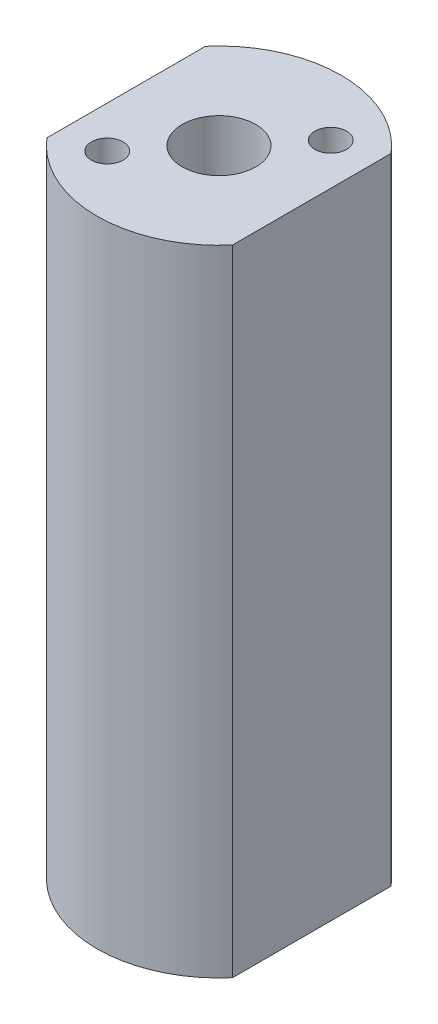
ISO-10303-21;
HEADER;
FILE_DESCRIPTION(('STEP AP214'),'2;1');
FILE_NAME('part.step','',(''),(''),'','','');
FILE_SCHEMA(('AUTOMOTIVE_DESIGN { 1 0 10303 214 1 1 1 1 }'));
ENDSEC;
DATA;
#1=APPLICATION_CONTEXT('core data for automotive mechanical design processes');
#2=APPLICATION_PROTOCOL_DEFINITION('international standard','automotive_design',2000,#1);
#3=PRODUCT_CONTEXT('',#1,'mechanical');
#4=PRODUCT('Part','Part','',(#3));
#5=PRODUCT_RELATED_PRODUCT_CATEGORY('part','',(#4));
#6=PRODUCT_DEFINITION_FORMATION('','',#4);
#7=PRODUCT_DEFINITION_CONTEXT('part definition',#1,'design');
#8=PRODUCT_DEFINITION('design','',#6,#7);
#9=PRODUCT_DEFINITION_SHAPE('','',#8);
#10=(LENGTH_UNIT() NAMED_UNIT(*) SI_UNIT(.MILLI.,.METRE.));
#11=(NAMED_UNIT(*) PLANE_ANGLE_UNIT() SI_UNIT($,.RADIAN.));
#12=(NAMED_UNIT(*) SI_UNIT($,.STERADIAN.) SOLID_ANGLE_UNIT());
#13=UNCERTAINTY_MEASURE_WITH_UNIT(LENGTH_MEASURE(1.E-05),#10,'distance_accuracy_value','');
#14=(GEOMETRIC_REPRESENTATION_CONTEXT(3) GLOBAL_UNCERTAINTY_ASSIGNED_CONTEXT((#13)) GLOBAL_UNIT_ASSIGNED_CONTEXT((#10,
#11,#12)) REPRESENTATION_CONTEXT('',''));
#15=CARTESIAN_POINT('',(0.,0.,0.));
#16=DIRECTION('',(0.,0.,1.));
#17=DIRECTION('',(1.,0.,0.));
#18=AXIS2_PLACEMENT_3D('',#15,#16,#17);
#19=CARTESIAN_POINT('',(0.,40.,0.));
#20=DIRECTION('',(0.,-1.,0.));
#21=DIRECTION('',(0.,0.,-1.));
#22=AXIS2_PLACEMENT_3D('',#19,#20,#21);
#23=CYLINDRICAL_SURFACE('',#22,7.695);
#24=CARTESIAN_POINT('',(0.,0.,0.));
#25=DIRECTION('',(0.,1.,0.));
#26=DIRECTION('',(0.,0.,1.));
#27=AXIS2_PLACEMENT_3D('',#24,#25,#26);
#28=CIRCLE('',#27,7.695);
#29=CARTESIAN_POINT('',(5.85,0.,-4.99905241020736));
#30=VERTEX_POINT('',#29);
#31=CARTESIAN_POINT('',(-5.85,0.,-4.99905241020736));
#32=VERTEX_POINT('',#31);
#33=EDGE_CURVE('E97',#30,#32,#28,.T.);
#34=ORIENTED_EDGE('',*,*,#33,.T.);
#35=DIRECTION('',(0.,-1.,0.));
#36=VECTOR('',#35,1.);
#37=CARTESIAN_POINT('',(-5.85,40.,-4.99905241020736));
#38=LINE('',#37,#36);
#39=CARTESIAN_POINT('',(-5.85,40.,-4.99905241020736));
#40=VERTEX_POINT('',#39);
#41=EDGE_CURVE('E11',#40,#32,#38,.T.);
#42=ORIENTED_EDGE('',*,*,#41,.F.);
#43=CARTESIAN_POINT('',(0.,40.,0.));
#44=DIRECTION('',(0.,1.,0.));
#45=DIRECTION('',(0.,0.,1.));
#46=AXIS2_PLACEMENT_3D('',#43,#44,#45);
#47=CIRCLE('',#46,7.695);
#48=CARTESIAN_POINT('',(5.85,40.,-4.99905241020736));
#49=VERTEX_POINT('',#48);
#50=EDGE_CURVE('E85',#49,#40,#47,.T.);
#51=ORIENTED_EDGE('',*,*,#50,.F.);
#52=DIRECTION('',(0.,-1.,0.));
#53=VECTOR('',#52,1.);
#54=CARTESIAN_POINT('',(5.85,40.,-4.99905241020736));
#55=LINE('',#54,#53);
#56=EDGE_CURVE('E93',#49,#30,#55,.T.);
#57=ORIENTED_EDGE('',*,*,#56,.T.);
#58=EDGE_LOOP('',(#34,#42,#51,#57));
#59=FACE_BOUND('',#58,.T.);
#60=ADVANCED_FACE('F34',(#59),#23,.T.);
#61=CARTESIAN_POINT('',(-5.85,40.,-4.99905241020736));
#62=DIRECTION('',(1.,0.,0.));
#63=DIRECTION('',(0.,0.,-1.));
#64=AXIS2_PLACEMENT_3D('',#61,#62,#63);
#65=PLANE('',#64);
#66=DIRECTION('',(0.,0.,1.));
#67=VECTOR('',#66,1.);
#68=CARTESIAN_POINT('',(-5.85,0.,-4.99905241020736));
#69=LINE('',#68,#67);
#70=CARTESIAN_POINT('',(-5.85,0.,4.99905241020736));
#71=VERTEX_POINT('',#70);
#72=EDGE_CURVE('E89',#32,#71,#69,.T.);
#73=ORIENTED_EDGE('',*,*,#72,.T.);
#74=DIRECTION('',(0.,-1.,0.));
#75=VECTOR('',#74,1.);
#76=CARTESIAN_POINT('',(-5.85,40.,4.99905241020736));
#77=LINE('',#76,#75);
#78=CARTESIAN_POINT('',(-5.85,40.,4.99905241020736));
#79=VERTEX_POINT('',#78);
#80=EDGE_CURVE('E42',#79,#71,#77,.T.);
#81=ORIENTED_EDGE('',*,*,#80,.F.);
#82=DIRECTION('',(0.,0.,1.));
#83=VECTOR('',#82,1.);
#84=CARTESIAN_POINT('',(-5.85,40.,-4.99905241020736));
#85=LINE('',#84,#83);
#86=EDGE_CURVE('E80',#40,#79,#85,.T.);
#87=ORIENTED_EDGE('',*,*,#86,.F.);
#88=ORIENTED_EDGE('',*,*,#41,.T.);
#89=EDGE_LOOP('',(#73,#81,#87,#88));
#90=FACE_BOUND('',#89,.T.);
#91=ADVANCED_FACE('F88',(#90),#65,.F.);
#92=CARTESIAN_POINT('',(0.,40.,0.));
#93=DIRECTION('',(0.,-1.,0.));
#94=DIRECTION('',(0.,0.,-1.));
#95=AXIS2_PLACEMENT_3D('',#92,#93,#94);
#96=CYLINDRICAL_SURFACE('',#95,7.695);
#97=CARTESIAN_POINT('',(0.,0.,0.));
#98=DIRECTION('',(0.,1.,0.));
#99=DIRECTION('',(0.,0.,1.));
#100=AXIS2_PLACEMENT_3D('',#97,#98,#99);
#101=CIRCLE('',#100,7.695);
#102=CARTESIAN_POINT('',(5.85,0.,4.99905241020736));
#103=VERTEX_POINT('',#102);
#104=EDGE_CURVE('E67',#71,#103,#101,.T.);
#105=ORIENTED_EDGE('',*,*,#104,.T.);
#106=DIRECTION('',(0.,-1.,0.));
#107=VECTOR('',#106,1.);
#108=CARTESIAN_POINT('',(5.85,40.,4.99905241020736));
#109=LINE('',#108,#107);
#110=CARTESIAN_POINT('',(5.85,40.,4.99905241020736));
#111=VERTEX_POINT('',#110);
#112=EDGE_CURVE('E90',#111,#103,#109,.T.);
#113=ORIENTED_EDGE('',*,*,#112,.F.);
#114=CARTESIAN_POINT('',(0.,40.,0.));
#115=DIRECTION('',(0.,1.,0.));
#116=DIRECTION('',(0.,0.,1.));
#117=AXIS2_PLACEMENT_3D('',#114,#115,#116);
#118=CIRCLE('',#117,7.695);
#119=EDGE_CURVE('E83',#79,#111,#118,.T.);
#120=ORIENTED_EDGE('',*,*,#119,.F.);
#121=ORIENTED_EDGE('',*,*,#80,.T.);
#122=EDGE_LOOP('',(#105,#113,#120,#121));
#123=FACE_BOUND('',#122,.T.);
#124=ADVANCED_FACE('F91',(#123),#96,.T.);
#125=CARTESIAN_POINT('',(5.85,40.,-4.99905241020736));
#126=DIRECTION('',(-1.,0.,0.));
#127=DIRECTION('',(0.,0.,1.));
#128=AXIS2_PLACEMENT_3D('',#125,#126,#127);
#129=PLANE('',#128);
#130=DIRECTION('',(0.,0.,-1.));
#131=VECTOR('',#130,1.);
#132=CARTESIAN_POINT('',(5.85,0.,-4.99905241020736));
#133=LINE('',#132,#131);
#134=EDGE_CURVE('E73',#103,#30,#133,.T.);
#135=ORIENTED_EDGE('',*,*,#134,.T.);
#136=ORIENTED_EDGE('',*,*,#56,.F.);
#137=DIRECTION('',(0.,0.,-1.));
#138=VECTOR('',#137,1.);
#139=CARTESIAN_POINT('',(5.85,40.,-4.99905241020736));
#140=LINE('',#139,#138);
#141=EDGE_CURVE('E50',#111,#49,#140,.T.);
#142=ORIENTED_EDGE('',*,*,#141,.F.);
#143=ORIENTED_EDGE('',*,*,#112,.T.);
#144=EDGE_LOOP('',(#135,#136,#142,#143));
#145=FACE_BOUND('',#144,.T.);
#146=ADVANCED_FACE('F105',(#145),#129,.F.);
#147=CARTESIAN_POINT('',(0.,40.,0.));
#148=DIRECTION('',(0.,1.,0.));
#149=DIRECTION('',(0.,0.,1.));
#150=AXIS2_PLACEMENT_3D('',#147,#148,#149);
#151=PLANE('',#150);
#152=CARTESIAN_POINT('',(-3.23074973562207,40.,3.81605242964218));
#153=DIRECTION('',(0.,1.,0.));
#154=DIRECTION('',(0.,0.,1.));
#155=AXIS2_PLACEMENT_3D('',#152,#153,#154);
#156=CIRCLE('',#155,1.);
#157=CARTESIAN_POINT('',(-3.23074973562207,40.,4.81605242964218));
#158=VERTEX_POINT('',#157);
#159=EDGE_CURVE('E123',#158,#158,#156,.T.);
#160=ORIENTED_EDGE('',*,*,#159,.F.);
#161=EDGE_LOOP('',(#160));
#162=FACE_BOUND('',#161,.T.);
#163=CARTESIAN_POINT('',(3.23074973562207,40.,-3.81605242964218));
#164=DIRECTION('',(0.,1.,0.));
#165=DIRECTION('',(0.,0.,1.));
#166=AXIS2_PLACEMENT_3D('',#163,#164,#165);
#167=CIRCLE('',#166,0.999999999999999);
#168=CARTESIAN_POINT('',(3.23074973562207,40.,-2.81605242964218));
#169=VERTEX_POINT('',#168);
#170=EDGE_CURVE('E117',#169,#169,#167,.T.);
#171=ORIENTED_EDGE('',*,*,#170,.F.);
#172=EDGE_LOOP('',(#171));
#173=FACE_BOUND('',#172,.T.);
#174=CARTESIAN_POINT('',(0.,40.,0.));
#175=DIRECTION('',(0.,1.,0.));
#176=DIRECTION('',(0.,0.,1.));
#177=AXIS2_PLACEMENT_3D('',#174,#175,#176);
#178=CIRCLE('',#177,2.32);
#179=CARTESIAN_POINT('',(0.,40.,2.32));
#180=VERTEX_POINT('',#179);
#181=EDGE_CURVE('E111',#180,#180,#178,.T.);
#182=ORIENTED_EDGE('',*,*,#181,.F.);
#183=EDGE_LOOP('',(#182));
#184=FACE_BOUND('',#183,.T.);
#185=ORIENTED_EDGE('',*,*,#50,.T.);
#186=ORIENTED_EDGE('',*,*,#86,.T.);
#187=ORIENTED_EDGE('',*,*,#119,.T.);
#188=ORIENTED_EDGE('',*,*,#141,.T.);
#189=EDGE_LOOP('',(#185,#186,#187,#188));
#190=FACE_BOUND('',#189,.T.);
#191=ADVANCED_FACE('F81',(#162,#173,#184,#190),#151,.T.);
#192=CARTESIAN_POINT('',(0.,0.,0.));
#193=DIRECTION('',(0.,1.,0.));
#194=DIRECTION('',(0.,0.,1.));
#195=AXIS2_PLACEMENT_3D('',#192,#193,#194);
#196=PLANE('',#195);
#197=CARTESIAN_POINT('',(-3.23074973562207,0.,3.81605242964218));
#198=DIRECTION('',(0.,1.,0.));
#199=DIRECTION('',(0.,0.,1.));
#200=AXIS2_PLACEMENT_3D('',#197,#198,#199);
#201=CIRCLE('',#200,1.);
#202=CARTESIAN_POINT('',(-3.23074973562207,0.,4.81605242964218));
#203=VERTEX_POINT('',#202);
#204=EDGE_CURVE('E120',#203,#203,#201,.T.);
#205=ORIENTED_EDGE('',*,*,#204,.T.);
#206=EDGE_LOOP('',(#205));
#207=FACE_BOUND('',#206,.T.);
#208=CARTESIAN_POINT('',(3.23074973562207,0.,-3.81605242964218));
#209=DIRECTION('',(0.,1.,0.));
#210=DIRECTION('',(0.,0.,1.));
#211=AXIS2_PLACEMENT_3D('',#208,#209,#210);
#212=CIRCLE('',#211,0.999999999999999);
#213=CARTESIAN_POINT('',(3.23074973562207,0.,-2.81605242964218));
#214=VERTEX_POINT('',#213);
#215=EDGE_CURVE('E114',#214,#214,#212,.T.);
#216=ORIENTED_EDGE('',*,*,#215,.T.);
#217=EDGE_LOOP('',(#216));
#218=FACE_BOUND('',#217,.T.);
#219=CARTESIAN_POINT('',(0.,0.,0.));
#220=DIRECTION('',(0.,1.,0.));
#221=DIRECTION('',(0.,0.,1.));
#222=AXIS2_PLACEMENT_3D('',#219,#220,#221);
#223=CIRCLE('',#222,2.32);
#224=CARTESIAN_POINT('',(0.,0.,2.32));
#225=VERTEX_POINT('',#224);
#226=EDGE_CURVE('E100',#225,#225,#223,.T.);
#227=ORIENTED_EDGE('',*,*,#226,.T.);
#228=EDGE_LOOP('',(#227));
#229=FACE_BOUND('',#228,.T.);
#230=ORIENTED_EDGE('',*,*,#33,.F.);
#231=ORIENTED_EDGE('',*,*,#134,.F.);
#232=ORIENTED_EDGE('',*,*,#104,.F.);
#233=ORIENTED_EDGE('',*,*,#72,.F.);
#234=EDGE_LOOP('',(#230,#231,#232,#233));
#235=FACE_BOUND('',#234,.T.);
#236=ADVANCED_FACE('F108',(#207,#218,#229,#235),#196,.F.);
#237=CARTESIAN_POINT('',(0.,0.,0.));
#238=DIRECTION('',(0.,1.,0.));
#239=DIRECTION('',(0.,0.,1.));
#240=AXIS2_PLACEMENT_3D('',#237,#238,#239);
#241=CYLINDRICAL_SURFACE('',#240,2.32);
#242=ORIENTED_EDGE('',*,*,#226,.F.);
#243=EDGE_LOOP('',(#242));
#244=FACE_BOUND('',#243,.T.);
#245=ORIENTED_EDGE('',*,*,#181,.T.);
#246=EDGE_LOOP('',(#245));
#247=FACE_BOUND('',#246,.T.);
#248=ADVANCED_FACE('F145',(#244,#247),#241,.F.);
#249=CARTESIAN_POINT('',(3.23074973562207,0.,-3.81605242964218));
#250=DIRECTION('',(0.,1.,0.));
#251=DIRECTION('',(0.,0.,1.));
#252=AXIS2_PLACEMENT_3D('',#249,#250,#251);
#253=CYLINDRICAL_SURFACE('',#252,0.999999999999999);
#254=ORIENTED_EDGE('',*,*,#215,.F.);
#255=EDGE_LOOP('',(#254));
#256=FACE_BOUND('',#255,.T.);
#257=ORIENTED_EDGE('',*,*,#170,.T.);
#258=EDGE_LOOP('',(#257));
#259=FACE_BOUND('',#258,.T.);
#260=ADVANCED_FACE('F134',(#256,#259),#253,.F.);
#261=CARTESIAN_POINT('',(-3.23074973562207,0.,3.81605242964218));
#262=DIRECTION('',(0.,1.,0.));
#263=DIRECTION('',(0.,0.,1.));
#264=AXIS2_PLACEMENT_3D('',#261,#262,#263);
#265=CYLINDRICAL_SURFACE('',#264,1.);
#266=ORIENTED_EDGE('',*,*,#204,.F.);
#267=EDGE_LOOP('',(#266));
#268=FACE_BOUND('',#267,.T.);
#269=ORIENTED_EDGE('',*,*,#159,.T.);
#270=EDGE_LOOP('',(#269));
#271=FACE_BOUND('',#270,.T.);
#272=ADVANCED_FACE('F131',(#268,#271),#265,.F.);
#273=CLOSED_SHELL('',(#60,#91,#124,#146,#191,#236,#248,#260,#272));
#274=MANIFOLD_SOLID_BREP('B2',#273);
#275=ADVANCED_BREP_SHAPE_REPRESENTATION('',(#18,#274),#14);
#276=SHAPE_DEFINITION_REPRESENTATION(#9,#275);
ENDSEC;
END-ISO-10303-21;
